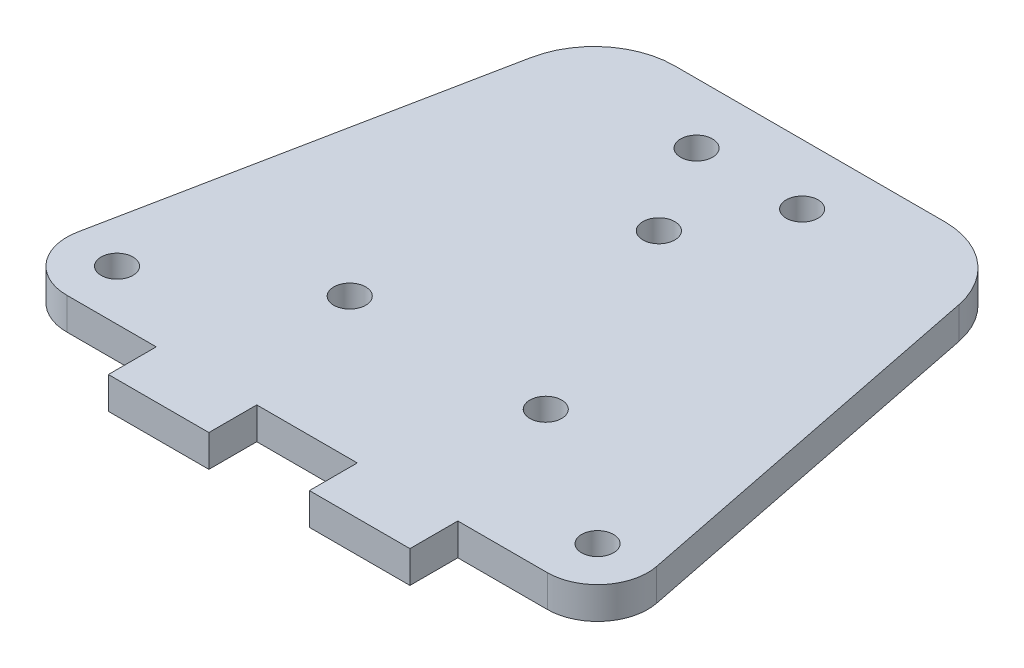
ISO-10303-21;
HEADER;
FILE_DESCRIPTION(('STEP AP214'),'2;1');
FILE_NAME('part.step','',(''),(''),'','','');
FILE_SCHEMA(('AUTOMOTIVE_DESIGN { 1 0 10303 214 1 1 1 1 }'));
ENDSEC;
DATA;
#1=APPLICATION_CONTEXT('core data for automotive mechanical design processes');
#2=APPLICATION_PROTOCOL_DEFINITION('international standard','automotive_design',2000,#1);
#3=PRODUCT_CONTEXT('',#1,'mechanical');
#4=PRODUCT('Part','Part','',(#3));
#5=PRODUCT_RELATED_PRODUCT_CATEGORY('part','',(#4));
#6=PRODUCT_DEFINITION_FORMATION('','',#4);
#7=PRODUCT_DEFINITION_CONTEXT('part definition',#1,'design');
#8=PRODUCT_DEFINITION('design','',#6,#7);
#9=PRODUCT_DEFINITION_SHAPE('','',#8);
#10=(LENGTH_UNIT() NAMED_UNIT(*) SI_UNIT(.MILLI.,.METRE.));
#11=(NAMED_UNIT(*) PLANE_ANGLE_UNIT() SI_UNIT($,.RADIAN.));
#12=(NAMED_UNIT(*) SI_UNIT($,.STERADIAN.) SOLID_ANGLE_UNIT());
#13=UNCERTAINTY_MEASURE_WITH_UNIT(LENGTH_MEASURE(1.E-05),#10,'distance_accuracy_value','');
#14=(GEOMETRIC_REPRESENTATION_CONTEXT(3) GLOBAL_UNCERTAINTY_ASSIGNED_CONTEXT((#13)) GLOBAL_UNIT_ASSIGNED_CONTEXT((#10,
#11,#12)) REPRESENTATION_CONTEXT('',''));
#15=CARTESIAN_POINT('',(0.,0.,0.));
#16=DIRECTION('',(0.,0.,1.));
#17=DIRECTION('',(1.,0.,0.));
#18=AXIS2_PLACEMENT_3D('',#15,#16,#17);
#19=CARTESIAN_POINT('',(0.,3.175,0.));
#20=DIRECTION('',(0.,0.,-1.));
#21=DIRECTION('',(-1.,0.,0.));
#22=AXIS2_PLACEMENT_3D('',#19,#20,#21);
#23=PLANE('',#22);
#24=DIRECTION('',(1.,0.,0.));
#25=VECTOR('',#24,1.);
#26=CARTESIAN_POINT('',(0.,0.,0.));
#27=LINE('',#26,#25);
#28=CARTESIAN_POINT('',(25.,0.,0.));
#29=VERTEX_POINT('',#28);
#30=CARTESIAN_POINT('',(35.,0.,0.));
#31=VERTEX_POINT('',#30);
#32=EDGE_CURVE('E302',#29,#31,#27,.T.);
#33=ORIENTED_EDGE('',*,*,#32,.T.);
#34=DIRECTION('',(0.,1.,0.));
#35=VECTOR('',#34,1.);
#36=CARTESIAN_POINT('',(35.,0.,0.));
#37=LINE('',#36,#35);
#38=CARTESIAN_POINT('',(35.,3.175,0.));
#39=VERTEX_POINT('',#38);
#40=EDGE_CURVE('E55',#31,#39,#37,.T.);
#41=ORIENTED_EDGE('',*,*,#40,.T.);
#42=DIRECTION('',(1.,0.,0.));
#43=VECTOR('',#42,1.);
#44=CARTESIAN_POINT('',(0.,3.175,0.));
#45=LINE('',#44,#43);
#46=CARTESIAN_POINT('',(25.,3.175,0.));
#47=VERTEX_POINT('',#46);
#48=EDGE_CURVE('E287',#47,#39,#45,.T.);
#49=ORIENTED_EDGE('',*,*,#48,.F.);
#50=DIRECTION('',(0.,1.,0.));
#51=VECTOR('',#50,1.);
#52=CARTESIAN_POINT('',(25.,0.,0.));
#53=LINE('',#52,#51);
#54=EDGE_CURVE('E204',#29,#47,#53,.T.);
#55=ORIENTED_EDGE('',*,*,#54,.F.);
#56=EDGE_LOOP('',(#33,#41,#49,#55));
#57=FACE_BOUND('',#56,.T.);
#58=ADVANCED_FACE('F32',(#57),#23,.F.);
#59=CARTESIAN_POINT('',(6.09901951359281,0.,0.));
#60=VERTEX_POINT('',#59);
#61=CARTESIAN_POINT('',(15.,0.,0.));
#62=VERTEX_POINT('',#61);
#63=EDGE_CURVE('E300',#60,#62,#27,.T.);
#64=ORIENTED_EDGE('',*,*,#63,.T.);
#65=DIRECTION('',(0.,1.,0.));
#66=VECTOR('',#65,1.);
#67=CARTESIAN_POINT('',(15.,0.,0.));
#68=LINE('',#67,#66);
#69=CARTESIAN_POINT('',(15.,3.175,0.));
#70=VERTEX_POINT('',#69);
#71=EDGE_CURVE('E201',#62,#70,#68,.T.);
#72=ORIENTED_EDGE('',*,*,#71,.T.);
#73=CARTESIAN_POINT('',(6.09901951359281,3.175,0.));
#74=VERTEX_POINT('',#73);
#75=EDGE_CURVE('E283',#74,#70,#45,.T.);
#76=ORIENTED_EDGE('',*,*,#75,.F.);
#77=DIRECTION('',(0.,1.,0.));
#78=VECTOR('',#77,1.);
#79=CARTESIAN_POINT('',(6.09901951359281,0.,0.));
#80=LINE('',#79,#78);
#81=EDGE_CURVE('E225',#60,#74,#80,.T.);
#82=ORIENTED_EDGE('',*,*,#81,.F.);
#83=EDGE_LOOP('',(#64,#72,#76,#82));
#84=FACE_BOUND('',#83,.T.);
#85=ADVANCED_FACE('F357',(#84),#23,.F.);
#86=CARTESIAN_POINT('',(45.,3.175,0.));
#87=VERTEX_POINT('',#86);
#88=CARTESIAN_POINT('',(53.9009804864072,3.175,0.));
#89=VERTEX_POINT('',#88);
#90=EDGE_CURVE('E47',#87,#89,#45,.T.);
#91=ORIENTED_EDGE('',*,*,#90,.F.);
#92=DIRECTION('',(0.,1.,0.));
#93=VECTOR('',#92,1.);
#94=CARTESIAN_POINT('',(45.,0.,0.));
#95=LINE('',#94,#93);
#96=CARTESIAN_POINT('',(45.,0.,0.));
#97=VERTEX_POINT('',#96);
#98=EDGE_CURVE('E180',#97,#87,#95,.T.);
#99=ORIENTED_EDGE('',*,*,#98,.F.);
#100=CARTESIAN_POINT('',(53.9009804864072,0.,0.));
#101=VERTEX_POINT('',#100);
#102=EDGE_CURVE('E299',#97,#101,#27,.T.);
#103=ORIENTED_EDGE('',*,*,#102,.T.);
#104=DIRECTION('',(0.,1.,0.));
#105=VECTOR('',#104,1.);
#106=CARTESIAN_POINT('',(53.9009804864072,0.,0.));
#107=LINE('',#106,#105);
#108=EDGE_CURVE('E213',#101,#89,#107,.T.);
#109=ORIENTED_EDGE('',*,*,#108,.T.);
#110=EDGE_LOOP('',(#91,#99,#103,#109));
#111=FACE_BOUND('',#110,.T.);
#112=ADVANCED_FACE('F373',(#111),#23,.F.);
#113=CARTESIAN_POINT('',(8.71378581622126,3.175,-43.5689290811055));
#114=DIRECTION('',(0.980580675690919,0.,0.196116135138188));
#115=DIRECTION('',(0.196116135138188,0.,-0.98058067569092));
#116=AXIS2_PLACEMENT_3D('',#113,#114,#115);
#117=PLANE('',#116);
#118=DIRECTION('',(0.,1.,0.));
#119=VECTOR('',#118,1.);
#120=CARTESIAN_POINT('',(1.19611613513821,0.,-5.98058067569094));
#121=LINE('',#120,#119);
#122=CARTESIAN_POINT('',(1.19611613513821,0.,-5.98058067569094));
#123=VERTEX_POINT('',#122);
#124=CARTESIAN_POINT('',(1.19611613513821,3.175,-5.98058067569094));
#125=VERTEX_POINT('',#124);
#126=EDGE_CURVE('E223',#123,#125,#121,.T.);
#127=ORIENTED_EDGE('',*,*,#126,.T.);
#128=DIRECTION('',(-0.196116135138188,0.,0.980580675690919));
#129=VECTOR('',#128,1.);
#130=CARTESIAN_POINT('',(8.71378581622126,3.175,-43.5689290811055));
#131=LINE('',#130,#129);
#132=CARTESIAN_POINT('',(8.71378581622126,3.175,-43.5689290811055));
#133=VERTEX_POINT('',#132);
#134=EDGE_CURVE('E280',#133,#125,#131,.T.);
#135=ORIENTED_EDGE('',*,*,#134,.F.);
#136=DIRECTION('',(0.,-1.,0.));
#137=VECTOR('',#136,1.);
#138=CARTESIAN_POINT('',(8.71378581622126,3.175,-43.5689290811055));
#139=LINE('',#138,#137);
#140=CARTESIAN_POINT('',(8.71378581622126,0.,-43.5689290811055));
#141=VERTEX_POINT('',#140);
#142=EDGE_CURVE('E306',#133,#141,#139,.T.);
#143=ORIENTED_EDGE('',*,*,#142,.T.);
#144=DIRECTION('',(-0.196116135138188,0.,0.980580675690919));
#145=VECTOR('',#144,1.);
#146=CARTESIAN_POINT('',(8.71378581622126,0.,-43.5689290811055));
#147=LINE('',#146,#145);
#148=EDGE_CURVE('E296',#141,#123,#147,.T.);
#149=ORIENTED_EDGE('',*,*,#148,.T.);
#150=EDGE_LOOP('',(#127,#135,#143,#149));
#151=FACE_BOUND('',#150,.T.);
#152=ADVANCED_FACE('F320',(#151),#117,.F.);
#153=CARTESIAN_POINT('',(43.4415687782517,3.175,-42.));
#154=DIRECTION('',(0.,1.,0.));
#155=DIRECTION('',(0.,0.,1.));
#156=AXIS2_PLACEMENT_3D('',#153,#154,#155);
#157=PLANE('',#156);
#158=CARTESIAN_POINT('',(53.9009804864072,3.175,-5.));
#159=DIRECTION('',(0.,-1.,0.));
#160=DIRECTION('',(0.,0.,1.));
#161=AXIS2_PLACEMENT_3D('',#158,#159,#160);
#162=CIRCLE('',#161,5.);
#163=CARTESIAN_POINT('',(58.8038838648618,3.175,-5.9805806756909));
#164=VERTEX_POINT('',#163);
#165=EDGE_CURVE('E203',#164,#89,#162,.T.);
#166=ORIENTED_EDGE('',*,*,#165,.F.);
#167=DIRECTION('',(-0.19611613513818,0.,-0.980580675690921));
#168=VECTOR('',#167,1.);
#169=CARTESIAN_POINT('',(51.2862141837791,3.175,-43.5689290811054));
#170=LINE('',#169,#168);
#171=CARTESIAN_POINT('',(51.2862141837791,3.175,-43.5689290811054));
#172=VERTEX_POINT('',#171);
#173=EDGE_CURVE('E286',#164,#172,#170,.T.);
#174=ORIENTED_EDGE('',*,*,#173,.T.);
#175=CARTESIAN_POINT('',(43.4415687782517,3.175,-42.));
#176=DIRECTION('',(0.,1.,0.));
#177=DIRECTION('',(0.,0.,1.));
#178=AXIS2_PLACEMENT_3D('',#175,#176,#177);
#179=CIRCLE('',#178,8.);
#180=CARTESIAN_POINT('',(43.4415687782517,3.175,-50.));
#181=VERTEX_POINT('',#180);
#182=EDGE_CURVE('E272',#172,#181,#179,.T.);
#183=ORIENTED_EDGE('',*,*,#182,.T.);
#184=DIRECTION('',(-1.,0.,0.));
#185=VECTOR('',#184,1.);
#186=CARTESIAN_POINT('',(16.5584312217487,3.175,-50.));
#187=LINE('',#186,#185);
#188=CARTESIAN_POINT('',(16.5584312217487,3.175,-50.));
#189=VERTEX_POINT('',#188);
#190=EDGE_CURVE('E275',#181,#189,#187,.T.);
#191=ORIENTED_EDGE('',*,*,#190,.T.);
#192=CARTESIAN_POINT('',(16.5584312217486,3.175,-42.));
#193=DIRECTION('',(0.,1.,0.));
#194=DIRECTION('',(0.,0.,-1.));
#195=AXIS2_PLACEMENT_3D('',#192,#193,#194);
#196=CIRCLE('',#195,8.);
#197=EDGE_CURVE('E278',#189,#133,#196,.T.);
#198=ORIENTED_EDGE('',*,*,#197,.T.);
#199=ORIENTED_EDGE('',*,*,#134,.T.);
#200=CARTESIAN_POINT('',(6.09901951359281,3.175,-5.));
#201=DIRECTION('',(0.,-1.,0.));
#202=DIRECTION('',(0.,0.,1.));
#203=AXIS2_PLACEMENT_3D('',#200,#201,#202);
#204=CIRCLE('',#203,5.);
#205=EDGE_CURVE('E218',#74,#125,#204,.T.);
#206=ORIENTED_EDGE('',*,*,#205,.F.);
#207=ORIENTED_EDGE('',*,*,#75,.T.);
#208=DIRECTION('',(0.,0.,1.));
#209=VECTOR('',#208,1.);
#210=CARTESIAN_POINT('',(15.,3.175,0.));
#211=LINE('',#210,#209);
#212=CARTESIAN_POINT('',(15.,3.175,4.7625));
#213=VERTEX_POINT('',#212);
#214=EDGE_CURVE('E179',#70,#213,#211,.T.);
#215=ORIENTED_EDGE('',*,*,#214,.T.);
#216=DIRECTION('',(1.,0.,0.));
#217=VECTOR('',#216,1.);
#218=CARTESIAN_POINT('',(15.,3.175,4.7625));
#219=LINE('',#218,#217);
#220=CARTESIAN_POINT('',(25.,3.175,4.7625));
#221=VERTEX_POINT('',#220);
#222=EDGE_CURVE('E196',#213,#221,#219,.T.);
#223=ORIENTED_EDGE('',*,*,#222,.T.);
#224=DIRECTION('',(0.,0.,-1.));
#225=VECTOR('',#224,1.);
#226=CARTESIAN_POINT('',(25.,3.175,0.));
#227=LINE('',#226,#225);
#228=EDGE_CURVE('E187',#221,#47,#227,.T.);
#229=ORIENTED_EDGE('',*,*,#228,.T.);
#230=ORIENTED_EDGE('',*,*,#48,.T.);
#231=DIRECTION('',(0.,0.,1.));
#232=VECTOR('',#231,1.);
#233=CARTESIAN_POINT('',(35.,3.175,0.));
#234=LINE('',#233,#232);
#235=CARTESIAN_POINT('',(35.,3.175,4.7625));
#236=VERTEX_POINT('',#235);
#237=EDGE_CURVE('E175',#39,#236,#234,.T.);
#238=ORIENTED_EDGE('',*,*,#237,.T.);
#239=DIRECTION('',(1.,0.,0.));
#240=VECTOR('',#239,1.);
#241=CARTESIAN_POINT('',(35.,3.175,4.7625));
#242=LINE('',#241,#240);
#243=CARTESIAN_POINT('',(45.,3.175,4.7625));
#244=VERTEX_POINT('',#243);
#245=EDGE_CURVE('E151',#236,#244,#242,.T.);
#246=ORIENTED_EDGE('',*,*,#245,.T.);
#247=DIRECTION('',(0.,0.,-1.));
#248=VECTOR('',#247,1.);
#249=CARTESIAN_POINT('',(45.,3.175,0.));
#250=LINE('',#249,#248);
#251=EDGE_CURVE('E169',#244,#87,#250,.T.);
#252=ORIENTED_EDGE('',*,*,#251,.T.);
#253=ORIENTED_EDGE('',*,*,#90,.T.);
#254=EDGE_LOOP('',(#166,#174,#183,#191,#198,#199,#206,#207,#215,#223,#229,#230,#238,#246,#252,#253));
#255=FACE_BOUND('',#254,.T.);
#256=CARTESIAN_POINT('',(53.9009804864072,3.175,-5.));
#257=DIRECTION('',(0.,1.,0.));
#258=DIRECTION('',(0.,0.,1.));
#259=AXIS2_PLACEMENT_3D('',#256,#257,#258);
#260=CIRCLE('',#259,1.5875);
#261=CARTESIAN_POINT('',(53.9009804864072,3.175,-3.4125));
#262=VERTEX_POINT('',#261);
#263=EDGE_CURVE('E227',#262,#262,#260,.T.);
#264=ORIENTED_EDGE('',*,*,#263,.F.);
#265=EDGE_LOOP('',(#264));
#266=FACE_BOUND('',#265,.T.);
#267=CARTESIAN_POINT('',(6.09901951359281,3.175,-5.));
#268=DIRECTION('',(0.,1.,0.));
#269=DIRECTION('',(0.,0.,1.));
#270=AXIS2_PLACEMENT_3D('',#267,#268,#269);
#271=CIRCLE('',#270,1.5875);
#272=CARTESIAN_POINT('',(6.09901951359281,3.175,-3.4125));
#273=VERTEX_POINT('',#272);
#274=EDGE_CURVE('E233',#273,#273,#271,.T.);
#275=ORIENTED_EDGE('',*,*,#274,.F.);
#276=EDGE_LOOP('',(#275));
#277=FACE_BOUND('',#276,.T.);
#278=CARTESIAN_POINT('',(30.,3.175,-35.));
#279=DIRECTION('',(0.,1.,0.));
#280=DIRECTION('',(0.,0.,1.));
#281=AXIS2_PLACEMENT_3D('',#278,#279,#280);
#282=CIRCLE('',#281,1.5875);
#283=CARTESIAN_POINT('',(30.,3.175,-33.4125));
#284=VERTEX_POINT('',#283);
#285=EDGE_CURVE('E239',#284,#284,#282,.T.);
#286=ORIENTED_EDGE('',*,*,#285,.F.);
#287=EDGE_LOOP('',(#286));
#288=FACE_BOUND('',#287,.T.);
#289=CARTESIAN_POINT('',(24.75,3.175,-44.));
#290=DIRECTION('',(0.,1.,0.));
#291=DIRECTION('',(0.,0.,1.));
#292=AXIS2_PLACEMENT_3D('',#289,#290,#291);
#293=CIRCLE('',#292,1.5875);
#294=CARTESIAN_POINT('',(24.75,3.175,-42.4125));
#295=VERTEX_POINT('',#294);
#296=EDGE_CURVE('E254',#295,#295,#293,.T.);
#297=ORIENTED_EDGE('',*,*,#296,.F.);
#298=EDGE_LOOP('',(#297));
#299=FACE_BOUND('',#298,.T.);
#300=CARTESIAN_POINT('',(39.75,3.175,-14.));
#301=DIRECTION('',(0.,1.,0.));
#302=DIRECTION('',(0.,0.,1.));
#303=AXIS2_PLACEMENT_3D('',#300,#301,#302);
#304=CIRCLE('',#303,1.5875);
#305=CARTESIAN_POINT('',(39.75,3.175,-12.4125));
#306=VERTEX_POINT('',#305);
#307=EDGE_CURVE('E266',#306,#306,#304,.T.);
#308=ORIENTED_EDGE('',*,*,#307,.F.);
#309=EDGE_LOOP('',(#308));
#310=FACE_BOUND('',#309,.T.);
#311=CARTESIAN_POINT('',(20.25,3.175,-14.));
#312=DIRECTION('',(0.,1.,0.));
#313=DIRECTION('',(0.,0.,1.));
#314=AXIS2_PLACEMENT_3D('',#311,#312,#313);
#315=CIRCLE('',#314,1.5875);
#316=CARTESIAN_POINT('',(20.25,3.175,-12.4125));
#317=VERTEX_POINT('',#316);
#318=EDGE_CURVE('E260',#317,#317,#315,.T.);
#319=ORIENTED_EDGE('',*,*,#318,.F.);
#320=EDGE_LOOP('',(#319));
#321=FACE_BOUND('',#320,.T.);
#322=CARTESIAN_POINT('',(35.25,3.175,-44.));
#323=DIRECTION('',(0.,1.,0.));
#324=DIRECTION('',(0.,0.,1.));
#325=AXIS2_PLACEMENT_3D('',#322,#323,#324);
#326=CIRCLE('',#325,1.5875);
#327=CARTESIAN_POINT('',(35.25,3.175,-42.4125));
#328=VERTEX_POINT('',#327);
#329=EDGE_CURVE('E248',#328,#328,#326,.T.);
#330=ORIENTED_EDGE('',*,*,#329,.F.);
#331=EDGE_LOOP('',(#330));
#332=FACE_BOUND('',#331,.T.);
#333=ADVANCED_FACE('F325',(#255,#266,#277,#288,#299,#310,#321,#332),#157,.T.);
#334=CARTESIAN_POINT('',(43.4415687782517,0.,-42.));
#335=DIRECTION('',(0.,1.,0.));
#336=DIRECTION('',(0.,0.,1.));
#337=AXIS2_PLACEMENT_3D('',#334,#335,#336);
#338=PLANE('',#337);
#339=CARTESIAN_POINT('',(53.9009804864072,0.,-5.));
#340=DIRECTION('',(0.,1.,0.));
#341=DIRECTION('',(0.,0.,1.));
#342=AXIS2_PLACEMENT_3D('',#339,#340,#341);
#343=CIRCLE('',#342,1.5875);
#344=CARTESIAN_POINT('',(53.9009804864072,0.,-3.4125));
#345=VERTEX_POINT('',#344);
#346=EDGE_CURVE('E230',#345,#345,#343,.T.);
#347=ORIENTED_EDGE('',*,*,#346,.T.);
#348=EDGE_LOOP('',(#347));
#349=FACE_BOUND('',#348,.T.);
#350=CARTESIAN_POINT('',(6.09901951359281,0.,-5.));
#351=DIRECTION('',(0.,1.,0.));
#352=DIRECTION('',(0.,0.,1.));
#353=AXIS2_PLACEMENT_3D('',#350,#351,#352);
#354=CIRCLE('',#353,1.5875);
#355=CARTESIAN_POINT('',(6.09901951359281,0.,-3.4125));
#356=VERTEX_POINT('',#355);
#357=EDGE_CURVE('E236',#356,#356,#354,.T.);
#358=ORIENTED_EDGE('',*,*,#357,.T.);
#359=EDGE_LOOP('',(#358));
#360=FACE_BOUND('',#359,.T.);
#361=CARTESIAN_POINT('',(30.,0.,-35.));
#362=DIRECTION('',(0.,1.,0.));
#363=DIRECTION('',(0.,0.,1.));
#364=AXIS2_PLACEMENT_3D('',#361,#362,#363);
#365=CIRCLE('',#364,1.5875);
#366=CARTESIAN_POINT('',(30.,0.,-33.4125));
#367=VERTEX_POINT('',#366);
#368=EDGE_CURVE('E242',#367,#367,#365,.T.);
#369=ORIENTED_EDGE('',*,*,#368,.T.);
#370=EDGE_LOOP('',(#369));
#371=FACE_BOUND('',#370,.T.);
#372=CARTESIAN_POINT('',(24.75,0.,-44.));
#373=DIRECTION('',(0.,1.,0.));
#374=DIRECTION('',(0.,0.,1.));
#375=AXIS2_PLACEMENT_3D('',#372,#373,#374);
#376=CIRCLE('',#375,1.5875);
#377=CARTESIAN_POINT('',(24.75,0.,-42.4125));
#378=VERTEX_POINT('',#377);
#379=EDGE_CURVE('E251',#378,#378,#376,.T.);
#380=ORIENTED_EDGE('',*,*,#379,.T.);
#381=EDGE_LOOP('',(#380));
#382=FACE_BOUND('',#381,.T.);
#383=CARTESIAN_POINT('',(39.75,0.,-14.));
#384=DIRECTION('',(0.,1.,0.));
#385=DIRECTION('',(0.,0.,1.));
#386=AXIS2_PLACEMENT_3D('',#383,#384,#385);
#387=CIRCLE('',#386,1.5875);
#388=CARTESIAN_POINT('',(39.75,0.,-12.4125));
#389=VERTEX_POINT('',#388);
#390=EDGE_CURVE('E263',#389,#389,#387,.T.);
#391=ORIENTED_EDGE('',*,*,#390,.T.);
#392=EDGE_LOOP('',(#391));
#393=FACE_BOUND('',#392,.T.);
#394=DIRECTION('',(-0.19611613513818,0.,-0.980580675690921));
#395=VECTOR('',#394,1.);
#396=CARTESIAN_POINT('',(51.2862141837791,0.,-43.5689290811054));
#397=LINE('',#396,#395);
#398=CARTESIAN_POINT('',(58.8038838648618,0.,-5.98058067569091));
#399=VERTEX_POINT('',#398);
#400=CARTESIAN_POINT('',(51.2862141837791,0.,-43.5689290811054));
#401=VERTEX_POINT('',#400);
#402=EDGE_CURVE('E276',#399,#401,#397,.T.);
#403=ORIENTED_EDGE('',*,*,#402,.F.);
#404=CARTESIAN_POINT('',(53.9009804864072,0.,-5.));
#405=DIRECTION('',(0.,-1.,0.));
#406=DIRECTION('',(0.,0.,1.));
#407=AXIS2_PLACEMENT_3D('',#404,#405,#406);
#408=CIRCLE('',#407,5.);
#409=EDGE_CURVE('E210',#399,#101,#408,.T.);
#410=ORIENTED_EDGE('',*,*,#409,.T.);
#411=ORIENTED_EDGE('',*,*,#102,.F.);
#412=DIRECTION('',(0.,0.,-1.));
#413=VECTOR('',#412,1.);
#414=CARTESIAN_POINT('',(45.,0.,0.));
#415=LINE('',#414,#413);
#416=CARTESIAN_POINT('',(45.,0.,4.7625));
#417=VERTEX_POINT('',#416);
#418=EDGE_CURVE('E157',#417,#97,#415,.T.);
#419=ORIENTED_EDGE('',*,*,#418,.F.);
#420=DIRECTION('',(1.,0.,0.));
#421=VECTOR('',#420,1.);
#422=CARTESIAN_POINT('',(35.,0.,4.7625));
#423=LINE('',#422,#421);
#424=CARTESIAN_POINT('',(35.,0.,4.7625));
#425=VERTEX_POINT('',#424);
#426=EDGE_CURVE('E149',#425,#417,#423,.T.);
#427=ORIENTED_EDGE('',*,*,#426,.F.);
#428=DIRECTION('',(0.,0.,1.));
#429=VECTOR('',#428,1.);
#430=CARTESIAN_POINT('',(35.,0.,0.));
#431=LINE('',#430,#429);
#432=EDGE_CURVE('E165',#31,#425,#431,.T.);
#433=ORIENTED_EDGE('',*,*,#432,.F.);
#434=ORIENTED_EDGE('',*,*,#32,.F.);
#435=DIRECTION('',(0.,0.,-1.));
#436=VECTOR('',#435,1.);
#437=CARTESIAN_POINT('',(25.,0.,0.));
#438=LINE('',#437,#436);
#439=CARTESIAN_POINT('',(25.,0.,4.7625));
#440=VERTEX_POINT('',#439);
#441=EDGE_CURVE('E190',#440,#29,#438,.T.);
#442=ORIENTED_EDGE('',*,*,#441,.F.);
#443=DIRECTION('',(1.,0.,0.));
#444=VECTOR('',#443,1.);
#445=CARTESIAN_POINT('',(15.,0.,4.7625));
#446=LINE('',#445,#444);
#447=CARTESIAN_POINT('',(15.,0.,4.7625));
#448=VERTEX_POINT('',#447);
#449=EDGE_CURVE('E186',#448,#440,#446,.T.);
#450=ORIENTED_EDGE('',*,*,#449,.F.);
#451=DIRECTION('',(0.,0.,1.));
#452=VECTOR('',#451,1.);
#453=CARTESIAN_POINT('',(15.,0.,0.));
#454=LINE('',#453,#452);
#455=EDGE_CURVE('E183',#62,#448,#454,.T.);
#456=ORIENTED_EDGE('',*,*,#455,.F.);
#457=ORIENTED_EDGE('',*,*,#63,.F.);
#458=CARTESIAN_POINT('',(6.09901951359281,0.,-5.));
#459=DIRECTION('',(0.,-1.,0.));
#460=DIRECTION('',(0.,0.,1.));
#461=AXIS2_PLACEMENT_3D('',#458,#459,#460);
#462=CIRCLE('',#461,5.);
#463=EDGE_CURVE('E220',#60,#123,#462,.T.);
#464=ORIENTED_EDGE('',*,*,#463,.T.);
#465=ORIENTED_EDGE('',*,*,#148,.F.);
#466=CARTESIAN_POINT('',(16.5584312217486,0.,-42.));
#467=DIRECTION('',(0.,1.,0.));
#468=DIRECTION('',(0.,0.,-1.));
#469=AXIS2_PLACEMENT_3D('',#466,#467,#468);
#470=CIRCLE('',#469,8.);
#471=CARTESIAN_POINT('',(16.5584312217487,0.,-50.));
#472=VERTEX_POINT('',#471);
#473=EDGE_CURVE('E294',#472,#141,#470,.T.);
#474=ORIENTED_EDGE('',*,*,#473,.F.);
#475=DIRECTION('',(-1.,0.,0.));
#476=VECTOR('',#475,1.);
#477=CARTESIAN_POINT('',(16.5584312217487,0.,-50.));
#478=LINE('',#477,#476);
#479=CARTESIAN_POINT('',(43.4415687782517,0.,-50.));
#480=VERTEX_POINT('',#479);
#481=EDGE_CURVE('E292',#480,#472,#478,.T.);
#482=ORIENTED_EDGE('',*,*,#481,.F.);
#483=CARTESIAN_POINT('',(43.4415687782517,0.,-42.));
#484=DIRECTION('',(0.,1.,0.));
#485=DIRECTION('',(0.,0.,1.));
#486=AXIS2_PLACEMENT_3D('',#483,#484,#485);
#487=CIRCLE('',#486,8.);
#488=EDGE_CURVE('E269',#401,#480,#487,.T.);
#489=ORIENTED_EDGE('',*,*,#488,.F.);
#490=EDGE_LOOP('',(#403,#410,#411,#419,#427,#433,#434,#442,#450,#456,#457,#464,#465,#474,#482,#489));
#491=FACE_BOUND('',#490,.T.);
#492=CARTESIAN_POINT('',(20.25,0.,-14.));
#493=DIRECTION('',(0.,1.,0.));
#494=DIRECTION('',(0.,0.,1.));
#495=AXIS2_PLACEMENT_3D('',#492,#493,#494);
#496=CIRCLE('',#495,1.5875);
#497=CARTESIAN_POINT('',(20.25,0.,-12.4125));
#498=VERTEX_POINT('',#497);
#499=EDGE_CURVE('E257',#498,#498,#496,.T.);
#500=ORIENTED_EDGE('',*,*,#499,.T.);
#501=EDGE_LOOP('',(#500));
#502=FACE_BOUND('',#501,.T.);
#503=CARTESIAN_POINT('',(35.25,0.,-44.));
#504=DIRECTION('',(0.,1.,0.));
#505=DIRECTION('',(0.,0.,1.));
#506=AXIS2_PLACEMENT_3D('',#503,#504,#505);
#507=CIRCLE('',#506,1.5875);
#508=CARTESIAN_POINT('',(35.25,0.,-42.4125));
#509=VERTEX_POINT('',#508);
#510=EDGE_CURVE('E245',#509,#509,#507,.T.);
#511=ORIENTED_EDGE('',*,*,#510,.T.);
#512=EDGE_LOOP('',(#511));
#513=FACE_BOUND('',#512,.T.);
#514=ADVANCED_FACE('F163',(#349,#360,#371,#382,#393,#491,#502,#513),#338,.F.);
#515=CARTESIAN_POINT('',(43.4415687782517,3.175,-42.));
#516=DIRECTION('',(0.,-1.,0.));
#517=DIRECTION('',(0.,0.,-1.));
#518=AXIS2_PLACEMENT_3D('',#515,#516,#517);
#519=CYLINDRICAL_SURFACE('',#518,8.);
#520=ORIENTED_EDGE('',*,*,#488,.T.);
#521=DIRECTION('',(0.,-1.,0.));
#522=VECTOR('',#521,1.);
#523=CARTESIAN_POINT('',(43.4415687782517,3.175,-50.));
#524=LINE('',#523,#522);
#525=EDGE_CURVE('E11',#181,#480,#524,.T.);
#526=ORIENTED_EDGE('',*,*,#525,.F.);
#527=ORIENTED_EDGE('',*,*,#182,.F.);
#528=DIRECTION('',(0.,-1.,0.));
#529=VECTOR('',#528,1.);
#530=CARTESIAN_POINT('',(51.2862141837791,3.175,-43.5689290811054));
#531=LINE('',#530,#529);
#532=EDGE_CURVE('E289',#172,#401,#531,.T.);
#533=ORIENTED_EDGE('',*,*,#532,.T.);
#534=EDGE_LOOP('',(#520,#526,#527,#533));
#535=FACE_BOUND('',#534,.T.);
#536=ADVANCED_FACE('F34',(#535),#519,.T.);
#537=CARTESIAN_POINT('',(16.5584312217487,3.175,-50.));
#538=DIRECTION('',(0.,0.,1.));
#539=DIRECTION('',(1.,0.,0.));
#540=AXIS2_PLACEMENT_3D('',#537,#538,#539);
#541=PLANE('',#540);
#542=ORIENTED_EDGE('',*,*,#481,.T.);
#543=DIRECTION('',(0.,-1.,0.));
#544=VECTOR('',#543,1.);
#545=CARTESIAN_POINT('',(16.5584312217487,3.175,-50.));
#546=LINE('',#545,#544);
#547=EDGE_CURVE('E40',#189,#472,#546,.T.);
#548=ORIENTED_EDGE('',*,*,#547,.F.);
#549=ORIENTED_EDGE('',*,*,#190,.F.);
#550=ORIENTED_EDGE('',*,*,#525,.T.);
#551=EDGE_LOOP('',(#542,#548,#549,#550));
#552=FACE_BOUND('',#551,.T.);
#553=ADVANCED_FACE('F330',(#552),#541,.F.);
#554=CARTESIAN_POINT('',(16.5584312217486,3.175,-42.));
#555=DIRECTION('',(0.,-1.,0.));
#556=DIRECTION('',(0.,0.,-1.));
#557=AXIS2_PLACEMENT_3D('',#554,#555,#556);
#558=CYLINDRICAL_SURFACE('',#557,8.);
#559=ORIENTED_EDGE('',*,*,#473,.T.);
#560=ORIENTED_EDGE('',*,*,#142,.F.);
#561=ORIENTED_EDGE('',*,*,#197,.F.);
#562=ORIENTED_EDGE('',*,*,#547,.T.);
#563=EDGE_LOOP('',(#559,#560,#561,#562));
#564=FACE_BOUND('',#563,.T.);
#565=ADVANCED_FACE('F313',(#564),#558,.T.);
#566=CARTESIAN_POINT('',(51.2862141837791,3.175,-43.5689290811054));
#567=DIRECTION('',(-0.980580675690921,0.,0.19611613513818));
#568=DIRECTION('',(0.19611613513818,0.,0.980580675690921));
#569=AXIS2_PLACEMENT_3D('',#566,#567,#568);
#570=PLANE('',#569);
#571=ORIENTED_EDGE('',*,*,#173,.F.);
#572=DIRECTION('',(0.,1.,0.));
#573=VECTOR('',#572,1.);
#574=CARTESIAN_POINT('',(58.8038838648618,0.,-5.9805806756909));
#575=LINE('',#574,#573);
#576=EDGE_CURVE('E216',#399,#164,#575,.T.);
#577=ORIENTED_EDGE('',*,*,#576,.F.);
#578=ORIENTED_EDGE('',*,*,#402,.T.);
#579=ORIENTED_EDGE('',*,*,#532,.F.);
#580=EDGE_LOOP('',(#571,#577,#578,#579));
#581=FACE_BOUND('',#580,.T.);
#582=ADVANCED_FACE('F336',(#581),#570,.F.);
#583=CARTESIAN_POINT('',(39.75,3.175,-14.));
#584=DIRECTION('',(0.,-1.,0.));
#585=DIRECTION('',(0.,0.,-1.));
#586=AXIS2_PLACEMENT_3D('',#583,#584,#585);
#587=CYLINDRICAL_SURFACE('',#586,1.5875);
#588=ORIENTED_EDGE('',*,*,#307,.T.);
#589=EDGE_LOOP('',(#588));
#590=FACE_BOUND('',#589,.T.);
#591=ORIENTED_EDGE('',*,*,#390,.F.);
#592=EDGE_LOOP('',(#591));
#593=FACE_BOUND('',#592,.T.);
#594=ADVANCED_FACE('F403',(#590,#593),#587,.F.);
#595=CARTESIAN_POINT('',(20.25,3.175,-14.));
#596=DIRECTION('',(0.,-1.,0.));
#597=DIRECTION('',(0.,0.,-1.));
#598=AXIS2_PLACEMENT_3D('',#595,#596,#597);
#599=CYLINDRICAL_SURFACE('',#598,1.5875);
#600=ORIENTED_EDGE('',*,*,#318,.T.);
#601=EDGE_LOOP('',(#600));
#602=FACE_BOUND('',#601,.T.);
#603=ORIENTED_EDGE('',*,*,#499,.F.);
#604=EDGE_LOOP('',(#603));
#605=FACE_BOUND('',#604,.T.);
#606=ADVANCED_FACE('F407',(#602,#605),#599,.F.);
#607=CARTESIAN_POINT('',(24.75,3.175,-44.));
#608=DIRECTION('',(0.,-1.,0.));
#609=DIRECTION('',(0.,0.,-1.));
#610=AXIS2_PLACEMENT_3D('',#607,#608,#609);
#611=CYLINDRICAL_SURFACE('',#610,1.5875);
#612=ORIENTED_EDGE('',*,*,#296,.T.);
#613=EDGE_LOOP('',(#612));
#614=FACE_BOUND('',#613,.T.);
#615=ORIENTED_EDGE('',*,*,#379,.F.);
#616=EDGE_LOOP('',(#615));
#617=FACE_BOUND('',#616,.T.);
#618=ADVANCED_FACE('F412',(#614,#617),#611,.F.);
#619=CARTESIAN_POINT('',(35.25,3.175,-44.));
#620=DIRECTION('',(0.,-1.,0.));
#621=DIRECTION('',(0.,0.,-1.));
#622=AXIS2_PLACEMENT_3D('',#619,#620,#621);
#623=CYLINDRICAL_SURFACE('',#622,1.5875);
#624=ORIENTED_EDGE('',*,*,#329,.T.);
#625=EDGE_LOOP('',(#624));
#626=FACE_BOUND('',#625,.T.);
#627=ORIENTED_EDGE('',*,*,#510,.F.);
#628=EDGE_LOOP('',(#627));
#629=FACE_BOUND('',#628,.T.);
#630=ADVANCED_FACE('F419',(#626,#629),#623,.F.);
#631=CARTESIAN_POINT('',(30.,0.,-35.));
#632=DIRECTION('',(0.,1.,0.));
#633=DIRECTION('',(0.,0.,1.));
#634=AXIS2_PLACEMENT_3D('',#631,#632,#633);
#635=CYLINDRICAL_SURFACE('',#634,1.5875);
#636=ORIENTED_EDGE('',*,*,#368,.F.);
#637=EDGE_LOOP('',(#636));
#638=FACE_BOUND('',#637,.T.);
#639=ORIENTED_EDGE('',*,*,#285,.T.);
#640=EDGE_LOOP('',(#639));
#641=FACE_BOUND('',#640,.T.);
#642=ADVANCED_FACE('F423',(#638,#641),#635,.F.);
#643=CARTESIAN_POINT('',(6.09901951359281,0.,-5.));
#644=DIRECTION('',(0.,1.,0.));
#645=DIRECTION('',(0.,0.,1.));
#646=AXIS2_PLACEMENT_3D('',#643,#644,#645);
#647=CYLINDRICAL_SURFACE('',#646,1.5875);
#648=ORIENTED_EDGE('',*,*,#357,.F.);
#649=EDGE_LOOP('',(#648));
#650=FACE_BOUND('',#649,.T.);
#651=ORIENTED_EDGE('',*,*,#274,.T.);
#652=EDGE_LOOP('',(#651));
#653=FACE_BOUND('',#652,.T.);
#654=ADVANCED_FACE('F368',(#650,#653),#647,.F.);
#655=CARTESIAN_POINT('',(53.9009804864072,0.,-5.));
#656=DIRECTION('',(0.,1.,0.));
#657=DIRECTION('',(0.,0.,1.));
#658=AXIS2_PLACEMENT_3D('',#655,#656,#657);
#659=CYLINDRICAL_SURFACE('',#658,1.5875);
#660=ORIENTED_EDGE('',*,*,#346,.F.);
#661=EDGE_LOOP('',(#660));
#662=FACE_BOUND('',#661,.T.);
#663=ORIENTED_EDGE('',*,*,#263,.T.);
#664=EDGE_LOOP('',(#663));
#665=FACE_BOUND('',#664,.T.);
#666=ADVANCED_FACE('F361',(#662,#665),#659,.F.);
#667=CARTESIAN_POINT('',(6.09901951359281,0.,-5.));
#668=DIRECTION('',(0.,1.,0.));
#669=DIRECTION('',(0.,0.,1.));
#670=AXIS2_PLACEMENT_3D('',#667,#668,#669);
#671=CYLINDRICAL_SURFACE('',#670,5.);
#672=ORIENTED_EDGE('',*,*,#205,.T.);
#673=ORIENTED_EDGE('',*,*,#126,.F.);
#674=ORIENTED_EDGE('',*,*,#463,.F.);
#675=ORIENTED_EDGE('',*,*,#81,.T.);
#676=EDGE_LOOP('',(#672,#673,#674,#675));
#677=FACE_BOUND('',#676,.T.);
#678=ADVANCED_FACE('F359',(#677),#671,.T.);
#679=CARTESIAN_POINT('',(53.9009804864072,0.,-5.));
#680=DIRECTION('',(0.,1.,0.));
#681=DIRECTION('',(0.,0.,1.));
#682=AXIS2_PLACEMENT_3D('',#679,#680,#681);
#683=CYLINDRICAL_SURFACE('',#682,5.);
#684=ORIENTED_EDGE('',*,*,#165,.T.);
#685=ORIENTED_EDGE('',*,*,#108,.F.);
#686=ORIENTED_EDGE('',*,*,#409,.F.);
#687=ORIENTED_EDGE('',*,*,#576,.T.);
#688=EDGE_LOOP('',(#684,#685,#686,#687));
#689=FACE_BOUND('',#688,.T.);
#690=ADVANCED_FACE('F338',(#689),#683,.T.);
#691=CARTESIAN_POINT('',(15.,0.,0.));
#692=DIRECTION('',(-1.,0.,0.));
#693=DIRECTION('',(0.,0.,1.));
#694=AXIS2_PLACEMENT_3D('',#691,#692,#693);
#695=PLANE('',#694);
#696=ORIENTED_EDGE('',*,*,#214,.F.);
#697=ORIENTED_EDGE('',*,*,#71,.F.);
#698=ORIENTED_EDGE('',*,*,#455,.T.);
#699=DIRECTION('',(0.,1.,0.));
#700=VECTOR('',#699,1.);
#701=CARTESIAN_POINT('',(15.,0.,4.7625));
#702=LINE('',#701,#700);
#703=EDGE_CURVE('E193',#448,#213,#702,.T.);
#704=ORIENTED_EDGE('',*,*,#703,.T.);
#705=EDGE_LOOP('',(#696,#697,#698,#704));
#706=FACE_BOUND('',#705,.T.);
#707=ADVANCED_FACE('F353',(#706),#695,.T.);
#708=CARTESIAN_POINT('',(25.,0.,0.));
#709=DIRECTION('',(1.,0.,0.));
#710=DIRECTION('',(0.,0.,-1.));
#711=AXIS2_PLACEMENT_3D('',#708,#709,#710);
#712=PLANE('',#711);
#713=ORIENTED_EDGE('',*,*,#228,.F.);
#714=DIRECTION('',(0.,1.,0.));
#715=VECTOR('',#714,1.);
#716=CARTESIAN_POINT('',(25.,0.,4.7625));
#717=LINE('',#716,#715);
#718=EDGE_CURVE('E207',#440,#221,#717,.T.);
#719=ORIENTED_EDGE('',*,*,#718,.F.);
#720=ORIENTED_EDGE('',*,*,#441,.T.);
#721=ORIENTED_EDGE('',*,*,#54,.T.);
#722=EDGE_LOOP('',(#713,#719,#720,#721));
#723=FACE_BOUND('',#722,.T.);
#724=ADVANCED_FACE('F344',(#723),#712,.T.);
#725=CARTESIAN_POINT('',(15.,0.,4.7625));
#726=DIRECTION('',(0.,0.,1.));
#727=DIRECTION('',(1.,0.,0.));
#728=AXIS2_PLACEMENT_3D('',#725,#726,#727);
#729=PLANE('',#728);
#730=ORIENTED_EDGE('',*,*,#222,.F.);
#731=ORIENTED_EDGE('',*,*,#703,.F.);
#732=ORIENTED_EDGE('',*,*,#449,.T.);
#733=ORIENTED_EDGE('',*,*,#718,.T.);
#734=EDGE_LOOP('',(#730,#731,#732,#733));
#735=FACE_BOUND('',#734,.T.);
#736=ADVANCED_FACE('F350',(#735),#729,.T.);
#737=CARTESIAN_POINT('',(35.,0.,0.));
#738=DIRECTION('',(-1.,0.,0.));
#739=DIRECTION('',(0.,0.,1.));
#740=AXIS2_PLACEMENT_3D('',#737,#738,#739);
#741=PLANE('',#740);
#742=ORIENTED_EDGE('',*,*,#237,.F.);
#743=ORIENTED_EDGE('',*,*,#40,.F.);
#744=ORIENTED_EDGE('',*,*,#432,.T.);
#745=DIRECTION('',(0.,1.,0.));
#746=VECTOR('',#745,1.);
#747=CARTESIAN_POINT('',(35.,0.,4.7625));
#748=LINE('',#747,#746);
#749=EDGE_CURVE('E146',#425,#236,#748,.T.);
#750=ORIENTED_EDGE('',*,*,#749,.T.);
#751=EDGE_LOOP('',(#742,#743,#744,#750));
#752=FACE_BOUND('',#751,.T.);
#753=ADVANCED_FACE('F168',(#752),#741,.T.);
#754=CARTESIAN_POINT('',(45.,0.,0.));
#755=DIRECTION('',(1.,0.,0.));
#756=DIRECTION('',(0.,0.,-1.));
#757=AXIS2_PLACEMENT_3D('',#754,#755,#756);
#758=PLANE('',#757);
#759=ORIENTED_EDGE('',*,*,#251,.F.);
#760=DIRECTION('',(0.,1.,0.));
#761=VECTOR('',#760,1.);
#762=CARTESIAN_POINT('',(45.,0.,4.7625));
#763=LINE('',#762,#761);
#764=EDGE_CURVE('E156',#417,#244,#763,.T.);
#765=ORIENTED_EDGE('',*,*,#764,.F.);
#766=ORIENTED_EDGE('',*,*,#418,.T.);
#767=ORIENTED_EDGE('',*,*,#98,.T.);
#768=EDGE_LOOP('',(#759,#765,#766,#767));
#769=FACE_BOUND('',#768,.T.);
#770=ADVANCED_FACE('F536',(#769),#758,.T.);
#771=CARTESIAN_POINT('',(35.,0.,4.7625));
#772=DIRECTION('',(0.,0.,1.));
#773=DIRECTION('',(1.,0.,0.));
#774=AXIS2_PLACEMENT_3D('',#771,#772,#773);
#775=PLANE('',#774);
#776=ORIENTED_EDGE('',*,*,#245,.F.);
#777=ORIENTED_EDGE('',*,*,#749,.F.);
#778=ORIENTED_EDGE('',*,*,#426,.T.);
#779=ORIENTED_EDGE('',*,*,#764,.T.);
#780=EDGE_LOOP('',(#776,#777,#778,#779));
#781=FACE_BOUND('',#780,.T.);
#782=ADVANCED_FACE('F148',(#781),#775,.T.);
#783=CLOSED_SHELL('',(#58,#85,#112,#152,#333,#514,#536,#553,#565,#582,#594,#606,#618,#630,#642,
#654,#666,#678,#690,#707,#724,#736,#753,#770,#782));
#784=MANIFOLD_SOLID_BREP('B2',#783);
#785=ADVANCED_BREP_SHAPE_REPRESENTATION('',(#18,#784),#14);
#786=SHAPE_DEFINITION_REPRESENTATION(#9,#785);
ENDSEC;
END-ISO-10303-21;
